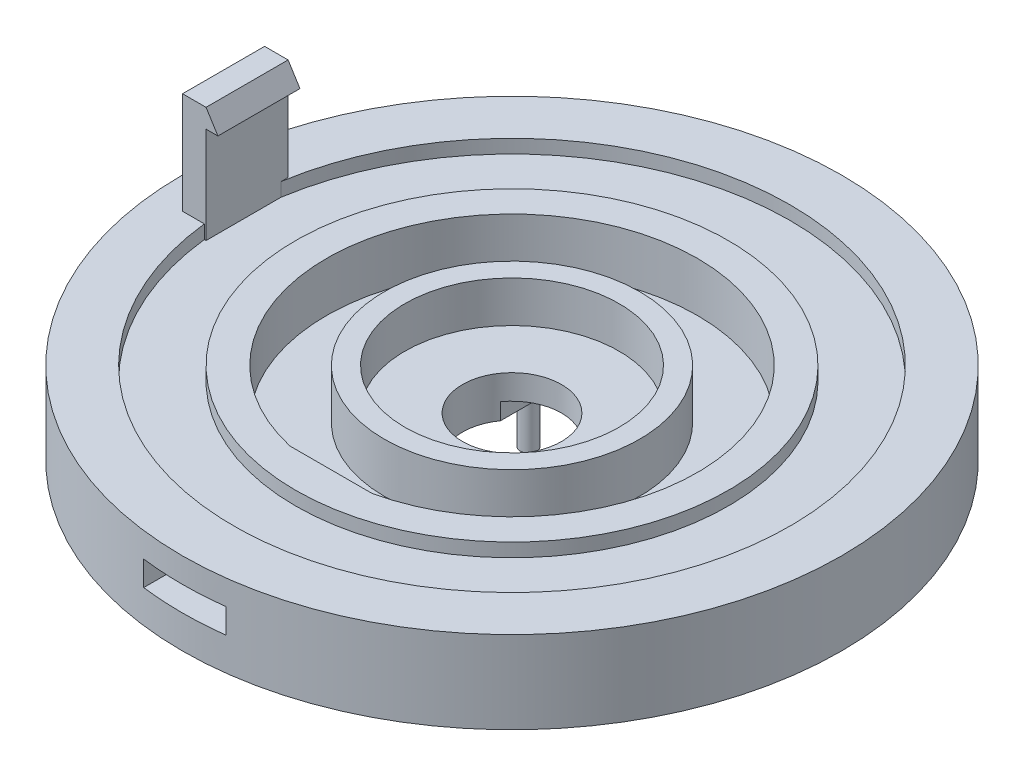
ISO-10303-21;
HEADER;
FILE_DESCRIPTION(('STEP AP214'),'2;1');
FILE_NAME('part.step','',(''),(''),'','','');
FILE_SCHEMA(('AUTOMOTIVE_DESIGN { 1 0 10303 214 1 1 1 1 }'));
ENDSEC;
DATA;
#1=APPLICATION_CONTEXT('core data for automotive mechanical design processes');
#2=APPLICATION_PROTOCOL_DEFINITION('international standard','automotive_design',2000,#1);
#3=PRODUCT_CONTEXT('',#1,'mechanical');
#4=PRODUCT('Part','Part','',(#3));
#5=PRODUCT_RELATED_PRODUCT_CATEGORY('part','',(#4));
#6=PRODUCT_DEFINITION_FORMATION('','',#4);
#7=PRODUCT_DEFINITION_CONTEXT('part definition',#1,'design');
#8=PRODUCT_DEFINITION('design','',#6,#7);
#9=PRODUCT_DEFINITION_SHAPE('','',#8);
#10=(LENGTH_UNIT() NAMED_UNIT(*) SI_UNIT(.MILLI.,.METRE.));
#11=(NAMED_UNIT(*) PLANE_ANGLE_UNIT() SI_UNIT($,.RADIAN.));
#12=(NAMED_UNIT(*) SI_UNIT($,.STERADIAN.) SOLID_ANGLE_UNIT());
#13=UNCERTAINTY_MEASURE_WITH_UNIT(LENGTH_MEASURE(1.E-05),#10,'distance_accuracy_value','');
#14=(GEOMETRIC_REPRESENTATION_CONTEXT(3) GLOBAL_UNCERTAINTY_ASSIGNED_CONTEXT((#13)) GLOBAL_UNIT_ASSIGNED_CONTEXT((#10,
#11,#12)) REPRESENTATION_CONTEXT('',''));
#15=CARTESIAN_POINT('',(0.,0.,0.));
#16=DIRECTION('',(0.,0.,1.));
#17=DIRECTION('',(1.,0.,0.));
#18=AXIS2_PLACEMENT_3D('',#15,#16,#17);
#19=CARTESIAN_POINT('',(0.,10.,0.));
#20=DIRECTION('',(0.,-1.,0.));
#21=DIRECTION('',(0.,0.,-1.));
#22=AXIS2_PLACEMENT_3D('',#19,#20,#21);
#23=PLANE('',#22);
#24=CARTESIAN_POINT('',(1.94458541445556,10.,-4.24128307319286));
#25=DIRECTION('',(0.,1.,0.));
#26=DIRECTION('',(0.,0.,1.));
#27=AXIS2_PLACEMENT_3D('',#24,#25,#26);
#28=CIRCLE('',#27,40.);
#29=CARTESIAN_POINT('',(1.94458541445556,10.,35.7587169268071));
#30=VERTEX_POINT('',#29);
#31=EDGE_CURVE('E253',#30,#30,#28,.T.);
#32=ORIENTED_EDGE('',*,*,#31,.T.);
#33=EDGE_LOOP('',(#32));
#34=FACE_BOUND('',#33,.T.);
#35=DIRECTION('',(1.,0.,0.));
#36=VECTOR('',#35,1.);
#37=CARTESIAN_POINT('',(0.,10.,-0.452703633644858));
#38=LINE('',#37,#36);
#39=CARTESIAN_POINT('',(-34.2364951699685,10.,-0.452703633644858));
#40=VERTEX_POINT('',#39);
#41=CARTESIAN_POINT('',(-31.5920984679773,10.,-0.452703633644858));
#42=VERTEX_POINT('',#41);
#43=EDGE_CURVE('E243',#40,#42,#38,.T.);
#44=ORIENTED_EDGE('',*,*,#43,.F.);
#45=DIRECTION('',(0.,0.,1.));
#46=VECTOR('',#45,1.);
#47=CARTESIAN_POINT('',(-34.2364951699685,10.,0.));
#48=LINE('',#47,#46);
#49=CARTESIAN_POINT('',(-34.2364951699685,10.,-10.4080430251595));
#50=VERTEX_POINT('',#49);
#51=EDGE_CURVE('E12',#50,#40,#48,.T.);
#52=ORIENTED_EDGE('',*,*,#51,.F.);
#53=DIRECTION('',(-1.,0.,0.));
#54=VECTOR('',#53,1.);
#55=CARTESIAN_POINT('',(0.,10.,-10.4080430251595));
#56=LINE('',#55,#54);
#57=CARTESIAN_POINT('',(-31.3854475420589,10.,-10.4080430251595));
#58=VERTEX_POINT('',#57);
#59=EDGE_CURVE('E95',#58,#50,#56,.T.);
#60=ORIENTED_EDGE('',*,*,#59,.F.);
#61=DIRECTION('',(0.,0.,-1.));
#62=VECTOR('',#61,1.);
#63=CARTESIAN_POINT('',(-31.3854475420589,10.,0.));
#64=LINE('',#63,#62);
#65=CARTESIAN_POINT('',(-31.3854475420589,10.,-9.54895705693214));
#66=VERTEX_POINT('',#65);
#67=EDGE_CURVE('E225',#66,#58,#64,.T.);
#68=ORIENTED_EDGE('',*,*,#67,.F.);
#69=CARTESIAN_POINT('',(1.94458541445557,10.,-4.24128307319287));
#70=DIRECTION('',(0.,1.,0.));
#71=DIRECTION('',(0.,0.,1.));
#72=AXIS2_PLACEMENT_3D('',#69,#70,#71);
#73=CIRCLE('',#72,33.75);
#74=EDGE_CURVE('E277',#42,#66,#73,.T.);
#75=ORIENTED_EDGE('',*,*,#74,.F.);
#76=EDGE_LOOP('',(#44,#52,#60,#68,#75));
#77=FACE_BOUND('',#76,.T.);
#78=ADVANCED_FACE('F87',(#34,#77),#23,.F.);
#79=CARTESIAN_POINT('',(1.94458541445557,8.35,-4.24128307319287));
#80=DIRECTION('',(0.,1.,0.));
#81=DIRECTION('',(0.,0.,1.));
#82=AXIS2_PLACEMENT_3D('',#79,#80,#81);
#83=CYLINDRICAL_SURFACE('',#82,33.75);
#84=DIRECTION('',(0.,1.,0.));
#85=VECTOR('',#84,1.);
#86=CARTESIAN_POINT('',(-31.5920984679773,8.35,-0.452703633644858));
#87=LINE('',#86,#85);
#88=CARTESIAN_POINT('',(-31.5920984679773,8.35,-0.452703633644858));
#89=VERTEX_POINT('',#88);
#90=EDGE_CURVE('E241',#42,#89,#87,.F.);
#91=ORIENTED_EDGE('',*,*,#90,.F.);
#92=ORIENTED_EDGE('',*,*,#74,.T.);
#93=DIRECTION('',(0.,1.,0.));
#94=VECTOR('',#93,1.);
#95=CARTESIAN_POINT('',(-31.3854475420589,8.35,-9.54895705693214));
#96=LINE('',#95,#94);
#97=CARTESIAN_POINT('',(-31.3854475420589,8.35,-9.54895705693214));
#98=VERTEX_POINT('',#97);
#99=EDGE_CURVE('E238',#98,#66,#96,.T.);
#100=ORIENTED_EDGE('',*,*,#99,.F.);
#101=CARTESIAN_POINT('',(1.94458541445557,8.35,-4.24128307319287));
#102=DIRECTION('',(0.,1.,0.));
#103=DIRECTION('',(0.,0.,1.));
#104=AXIS2_PLACEMENT_3D('',#101,#102,#103);
#105=CIRCLE('',#104,33.75);
#106=EDGE_CURVE('E280',#89,#98,#105,.T.);
#107=ORIENTED_EDGE('',*,*,#106,.F.);
#108=EDGE_LOOP('',(#91,#92,#100,#107));
#109=FACE_BOUND('',#108,.T.);
#110=ADVANCED_FACE('F391',(#109),#83,.F.);
#111=CARTESIAN_POINT('',(1.94458541445557,8.35,-4.24128307319287));
#112=DIRECTION('',(0.,1.,0.));
#113=DIRECTION('',(0.,0.,1.));
#114=AXIS2_PLACEMENT_3D('',#111,#112,#113);
#115=PLANE('',#114);
#116=CARTESIAN_POINT('',(1.94458541445557,8.35,-4.24128307319287));
#117=DIRECTION('',(0.,1.,0.));
#118=DIRECTION('',(0.,0.,1.));
#119=AXIS2_PLACEMENT_3D('',#116,#117,#118);
#120=CIRCLE('',#119,26.25);
#121=CARTESIAN_POINT('',(1.94458541445557,8.35,22.0087169268071));
#122=VERTEX_POINT('',#121);
#123=EDGE_CURVE('E274',#122,#122,#120,.T.);
#124=ORIENTED_EDGE('',*,*,#123,.F.);
#125=EDGE_LOOP('',(#124));
#126=FACE_BOUND('',#125,.T.);
#127=DIRECTION('',(0.,0.,-1.));
#128=VECTOR('',#127,1.);
#129=CARTESIAN_POINT('',(-31.3854475420589,8.35,-10.4080430251595));
#130=LINE('',#129,#128);
#131=CARTESIAN_POINT('',(-31.3854475420589,8.35,-0.452703633644858));
#132=VERTEX_POINT('',#131);
#133=EDGE_CURVE('E396',#132,#98,#130,.T.);
#134=ORIENTED_EDGE('',*,*,#133,.F.);
#135=DIRECTION('',(-1.,0.,0.));
#136=VECTOR('',#135,1.);
#137=CARTESIAN_POINT('',(1.94458541445557,8.35,-0.452703633644858));
#138=LINE('',#137,#136);
#139=EDGE_CURVE('E373',#132,#89,#138,.T.);
#140=ORIENTED_EDGE('',*,*,#139,.T.);
#141=ORIENTED_EDGE('',*,*,#106,.T.);
#142=EDGE_LOOP('',(#134,#140,#141));
#143=FACE_BOUND('',#142,.T.);
#144=ADVANCED_FACE('F395',(#126,#143),#115,.T.);
#145=CARTESIAN_POINT('',(0.,0.,0.));
#146=DIRECTION('',(0.,-1.,0.));
#147=DIRECTION('',(0.,0.,-1.));
#148=AXIS2_PLACEMENT_3D('',#145,#146,#147);
#149=PLANE('',#148);
#150=DIRECTION('',(0.,0.,-1.));
#151=VECTOR('',#150,1.);
#152=CARTESIAN_POINT('',(-2.93335983094335,0.,-18.6283350162171));
#153=LINE('',#152,#151);
#154=CARTESIAN_POINT('',(-2.93335983094335,0.,-7.73494164020971));
#155=VERTEX_POINT('',#154);
#156=CARTESIAN_POINT('',(-2.93335983094335,0.,-18.6283350162171));
#157=VERTEX_POINT('',#156);
#158=EDGE_CURVE('E259',#155,#157,#153,.T.);
#159=ORIENTED_EDGE('',*,*,#158,.F.);
#160=CARTESIAN_POINT('',(1.94458541445556,0.,-4.24128307319286));
#161=DIRECTION('',(0.,1.,0.));
#162=DIRECTION('',(0.,0.,1.));
#163=AXIS2_PLACEMENT_3D('',#160,#161,#162);
#164=CIRCLE('',#163,6.);
#165=CARTESIAN_POINT('',(6.86664016905719,0.,-7.67251856390221));
#166=VERTEX_POINT('',#165);
#167=EDGE_CURVE('E356',#155,#166,#164,.T.);
#168=ORIENTED_EDGE('',*,*,#167,.T.);
#169=DIRECTION('',(0.,0.,1.));
#170=VECTOR('',#169,1.);
#171=CARTESIAN_POINT('',(6.86664016905719,0.,-7.59099295485299));
#172=LINE('',#171,#170);
#173=CARTESIAN_POINT('',(6.86664016905719,0.,-18.6283350162171));
#174=VERTEX_POINT('',#173);
#175=EDGE_CURVE('E266',#174,#166,#172,.T.);
#176=ORIENTED_EDGE('',*,*,#175,.F.);
#177=DIRECTION('',(1.,0.,0.));
#178=VECTOR('',#177,1.);
#179=CARTESIAN_POINT('',(6.86664016905719,0.,-18.6283350162171));
#180=LINE('',#179,#178);
#181=EDGE_CURVE('E256',#157,#174,#180,.T.);
#182=ORIENTED_EDGE('',*,*,#181,.F.);
#183=EDGE_LOOP('',(#159,#168,#176,#182));
#184=FACE_BOUND('',#183,.T.);
#185=CARTESIAN_POINT('',(-8.55541458554444,0.,-4.24128307319286));
#186=DIRECTION('',(0.,-1.,0.));
#187=DIRECTION('',(0.,0.,1.));
#188=AXIS2_PLACEMENT_3D('',#185,#186,#187);
#189=CIRCLE('',#188,1.);
#190=CARTESIAN_POINT('',(-8.55541458554444,0.,-3.24128307319286));
#191=VERTEX_POINT('',#190);
#192=EDGE_CURVE('E321',#191,#191,#189,.T.);
#193=ORIENTED_EDGE('',*,*,#192,.F.);
#194=EDGE_LOOP('',(#193));
#195=FACE_BOUND('',#194,.T.);
#196=CARTESIAN_POINT('',(-8.55541458554444,0.,-16.7412830731929));
#197=DIRECTION('',(0.,-1.,0.));
#198=DIRECTION('',(0.,0.,1.));
#199=AXIS2_PLACEMENT_3D('',#196,#197,#198);
#200=CIRCLE('',#199,1.);
#201=CARTESIAN_POINT('',(-8.55541458554444,0.,-15.7412830731929));
#202=VERTEX_POINT('',#201);
#203=EDGE_CURVE('E327',#202,#202,#200,.T.);
#204=ORIENTED_EDGE('',*,*,#203,.F.);
#205=EDGE_LOOP('',(#204));
#206=FACE_BOUND('',#205,.T.);
#207=CARTESIAN_POINT('',(12.4445854144556,0.,-4.24128307319286));
#208=DIRECTION('',(0.,-1.,0.));
#209=DIRECTION('',(0.,0.,-1.));
#210=AXIS2_PLACEMENT_3D('',#207,#208,#209);
#211=CIRCLE('',#210,1.);
#212=CARTESIAN_POINT('',(12.4445854144556,0.,-5.24128307319286));
#213=VERTEX_POINT('',#212);
#214=EDGE_CURVE('E333',#213,#213,#211,.T.);
#215=ORIENTED_EDGE('',*,*,#214,.F.);
#216=EDGE_LOOP('',(#215));
#217=FACE_BOUND('',#216,.T.);
#218=CARTESIAN_POINT('',(12.4445854144556,0.,-16.7412830731929));
#219=DIRECTION('',(0.,-1.,0.));
#220=DIRECTION('',(0.,0.,-1.));
#221=AXIS2_PLACEMENT_3D('',#218,#219,#220);
#222=CIRCLE('',#221,1.);
#223=CARTESIAN_POINT('',(12.4445854144556,0.,-17.7412830731929));
#224=VERTEX_POINT('',#223);
#225=EDGE_CURVE('E339',#224,#224,#222,.T.);
#226=ORIENTED_EDGE('',*,*,#225,.F.);
#227=EDGE_LOOP('',(#226));
#228=FACE_BOUND('',#227,.T.);
#229=CARTESIAN_POINT('',(1.94458541445556,0.,-4.24128307319286));
#230=DIRECTION('',(0.,-1.,0.));
#231=DIRECTION('',(0.,0.,-1.));
#232=AXIS2_PLACEMENT_3D('',#229,#230,#231);
#233=CIRCLE('',#232,40.);
#234=CARTESIAN_POINT('',(1.94458541445556,0.,-44.2412830731929));
#235=VERTEX_POINT('',#234);
#236=EDGE_CURVE('E368',#235,#235,#233,.T.);
#237=ORIENTED_EDGE('',*,*,#236,.T.);
#238=EDGE_LOOP('',(#237));
#239=FACE_BOUND('',#238,.T.);
#240=ADVANCED_FACE('F89',(#184,#195,#206,#217,#228,#239),#149,.T.);
#241=CARTESIAN_POINT('',(1.94458541445556,4.,-4.24128307319286));
#242=DIRECTION('',(0.,1.,0.));
#243=DIRECTION('',(0.,0.,1.));
#244=AXIS2_PLACEMENT_3D('',#241,#242,#243);
#245=PLANE('',#244);
#246=CARTESIAN_POINT('',(1.94458541445556,4.,-4.24128307319286));
#247=DIRECTION('',(0.,1.,0.));
#248=DIRECTION('',(0.,0.,1.));
#249=AXIS2_PLACEMENT_3D('',#246,#247,#248);
#250=CIRCLE('',#249,15.5);
#251=CARTESIAN_POINT('',(1.94458541445556,4.,11.2587169268071));
#252=VERTEX_POINT('',#251);
#253=EDGE_CURVE('E312',#252,#252,#250,.T.);
#254=ORIENTED_EDGE('',*,*,#253,.F.);
#255=EDGE_LOOP('',(#254));
#256=FACE_BOUND('',#255,.T.);
#257=CARTESIAN_POINT('',(1.94458541445556,4.,-4.24128307319286));
#258=DIRECTION('',(0.,1.,0.));
#259=DIRECTION('',(0.,0.,1.));
#260=AXIS2_PLACEMENT_3D('',#257,#258,#259);
#261=CIRCLE('',#260,40.);
#262=CARTESIAN_POINT('',(-3.05541458554445,4.,35.444986592776));
#263=VERTEX_POINT('',#262);
#264=CARTESIAN_POINT('',(6.94458541445556,4.,35.444986592776));
#265=VERTEX_POINT('',#264);
#266=EDGE_CURVE('E251',#263,#265,#261,.T.);
#267=ORIENTED_EDGE('',*,*,#266,.T.);
#268=DIRECTION('',(0.,0.,1.));
#269=VECTOR('',#268,1.);
#270=CARTESIAN_POINT('',(6.94458541445559,4.,0.));
#271=LINE('',#270,#269);
#272=CARTESIAN_POINT('',(6.94458541445557,4.,17.6961278952874));
#273=VERTEX_POINT('',#272);
#274=EDGE_CURVE('E300',#273,#265,#271,.T.);
#275=ORIENTED_EDGE('',*,*,#274,.F.);
#276=CARTESIAN_POINT('',(1.94458541445556,4.,-4.24128307319286));
#277=DIRECTION('',(0.,1.,0.));
#278=DIRECTION('',(0.,0.,1.));
#279=AXIS2_PLACEMENT_3D('',#276,#277,#278);
#280=CIRCLE('',#279,22.5);
#281=CARTESIAN_POINT('',(-3.05541458554445,4.,17.6961278952874));
#282=VERTEX_POINT('',#281);
#283=EDGE_CURVE('E318',#273,#282,#280,.T.);
#284=ORIENTED_EDGE('',*,*,#283,.T.);
#285=DIRECTION('',(0.,0.,-1.));
#286=VECTOR('',#285,1.);
#287=CARTESIAN_POINT('',(-3.05541458554445,4.,0.));
#288=LINE('',#287,#286);
#289=EDGE_CURVE('E303',#263,#282,#288,.T.);
#290=ORIENTED_EDGE('',*,*,#289,.F.);
#291=EDGE_LOOP('',(#267,#275,#284,#290));
#292=FACE_BOUND('',#291,.T.);
#293=ADVANCED_FACE('F474',(#256,#292),#245,.T.);
#294=CARTESIAN_POINT('',(9.94458541445556,7.,35.7587169268071));
#295=DIRECTION('',(0.,1.,0.));
#296=DIRECTION('',(0.,0.,1.));
#297=AXIS2_PLACEMENT_3D('',#294,#295,#296);
#298=PLANE('',#297);
#299=DIRECTION('',(0.,0.,-1.));
#300=VECTOR('',#299,1.);
#301=CARTESIAN_POINT('',(6.94458541445559,7.,0.));
#302=LINE('',#301,#300);
#303=CARTESIAN_POINT('',(6.94458541445556,7.,35.444986592776));
#304=VERTEX_POINT('',#303);
#305=CARTESIAN_POINT('',(6.94458541445557,7.,17.6961278952874));
#306=VERTEX_POINT('',#305);
#307=EDGE_CURVE('E298',#304,#306,#302,.T.);
#308=ORIENTED_EDGE('',*,*,#307,.F.);
#309=CARTESIAN_POINT('',(1.94458541445556,7.,-4.24128307319286));
#310=DIRECTION('',(0.,1.,0.));
#311=DIRECTION('',(0.,0.,1.));
#312=AXIS2_PLACEMENT_3D('',#309,#310,#311);
#313=CIRCLE('',#312,40.);
#314=CARTESIAN_POINT('',(-3.05541458554444,7.,35.444986592776));
#315=VERTEX_POINT('',#314);
#316=EDGE_CURVE('E371',#315,#304,#313,.T.);
#317=ORIENTED_EDGE('',*,*,#316,.F.);
#318=DIRECTION('',(0.,0.,-1.));
#319=VECTOR('',#318,1.);
#320=CARTESIAN_POINT('',(-3.05541458554445,7.,35.7587169268071));
#321=LINE('',#320,#319);
#322=CARTESIAN_POINT('',(-3.05541458554445,7.,17.6961278952874));
#323=VERTEX_POINT('',#322);
#324=EDGE_CURVE('E283',#315,#323,#321,.T.);
#325=ORIENTED_EDGE('',*,*,#324,.T.);
#326=DIRECTION('',(-1.,0.,0.));
#327=VECTOR('',#326,1.);
#328=CARTESIAN_POINT('',(9.94458541445556,7.,17.6961278952874));
#329=LINE('',#328,#327);
#330=EDGE_CURVE('E292',#306,#323,#329,.T.);
#331=ORIENTED_EDGE('',*,*,#330,.F.);
#332=EDGE_LOOP('',(#308,#317,#325,#331));
#333=FACE_BOUND('',#332,.T.);
#334=ADVANCED_FACE('F476',(#333),#298,.F.);
#335=CARTESIAN_POINT('',(6.94458541445559,4.,0.));
#336=DIRECTION('',(-1.,0.,0.));
#337=DIRECTION('',(0.,0.,1.));
#338=AXIS2_PLACEMENT_3D('',#335,#336,#337);
#339=PLANE('',#338);
#340=ORIENTED_EDGE('',*,*,#274,.T.);
#341=DIRECTION('',(0.,1.,0.));
#342=VECTOR('',#341,1.);
#343=CARTESIAN_POINT('',(6.94458541445556,-10.,35.444986592776));
#344=LINE('',#343,#342);
#345=EDGE_CURVE('E245',#265,#304,#344,.T.);
#346=ORIENTED_EDGE('',*,*,#345,.T.);
#347=ORIENTED_EDGE('',*,*,#307,.T.);
#348=DIRECTION('',(0.,1.,0.));
#349=VECTOR('',#348,1.);
#350=CARTESIAN_POINT('',(6.94458541445557,4.,17.6961278952874));
#351=LINE('',#350,#349);
#352=EDGE_CURVE('E305',#273,#306,#351,.T.);
#353=ORIENTED_EDGE('',*,*,#352,.F.);
#354=EDGE_LOOP('',(#340,#346,#347,#353));
#355=FACE_BOUND('',#354,.T.);
#356=ADVANCED_FACE('F472',(#355),#339,.T.);
#357=CARTESIAN_POINT('',(-3.05541458554445,4.,0.));
#358=DIRECTION('',(1.,0.,0.));
#359=DIRECTION('',(0.,0.,-1.));
#360=AXIS2_PLACEMENT_3D('',#357,#358,#359);
#361=PLANE('',#360);
#362=ORIENTED_EDGE('',*,*,#324,.F.);
#363=DIRECTION('',(0.,1.,0.));
#364=VECTOR('',#363,1.);
#365=CARTESIAN_POINT('',(-3.05541458554445,-10.,35.444986592776));
#366=LINE('',#365,#364);
#367=EDGE_CURVE('E248',#315,#263,#366,.F.);
#368=ORIENTED_EDGE('',*,*,#367,.T.);
#369=ORIENTED_EDGE('',*,*,#289,.T.);
#370=DIRECTION('',(0.,1.,0.));
#371=VECTOR('',#370,1.);
#372=CARTESIAN_POINT('',(-3.05541458554445,4.,17.6961278952874));
#373=LINE('',#372,#371);
#374=EDGE_CURVE('E306',#282,#323,#373,.T.);
#375=ORIENTED_EDGE('',*,*,#374,.T.);
#376=EDGE_LOOP('',(#362,#368,#369,#375));
#377=FACE_BOUND('',#376,.T.);
#378=ADVANCED_FACE('F436',(#377),#361,.T.);
#379=CARTESIAN_POINT('',(1.94458541445556,10.,-4.24128307319286));
#380=DIRECTION('',(0.,1.,0.));
#381=DIRECTION('',(0.,0.,1.));
#382=AXIS2_PLACEMENT_3D('',#379,#380,#381);
#383=CIRCLE('',#382,22.5);
#384=CARTESIAN_POINT('',(6.94458541445556,10.,17.6961278952874));
#385=VERTEX_POINT('',#384);
#386=CARTESIAN_POINT('',(-3.05541458554445,10.,17.6961278952874));
#387=VERTEX_POINT('',#386);
#388=EDGE_CURVE('E315',#385,#387,#383,.T.);
#389=ORIENTED_EDGE('',*,*,#388,.F.);
#390=DIRECTION('',(-1.,0.,0.));
#391=VECTOR('',#390,1.);
#392=CARTESIAN_POINT('',(9.94458541445556,10.,17.6961278952874));
#393=LINE('',#392,#391);
#394=EDGE_CURVE('E289',#385,#387,#393,.T.);
#395=ORIENTED_EDGE('',*,*,#394,.T.);
#396=EDGE_LOOP('',(#389,#395));
#397=FACE_BOUND('',#396,.T.);
#398=CARTESIAN_POINT('',(1.94458541445557,10.,-4.24128307319287));
#399=DIRECTION('',(0.,1.,0.));
#400=DIRECTION('',(0.,0.,1.));
#401=AXIS2_PLACEMENT_3D('',#398,#399,#400);
#402=CIRCLE('',#401,26.25);
#403=CARTESIAN_POINT('',(1.94458541445557,10.,22.0087169268071));
#404=VERTEX_POINT('',#403);
#405=EDGE_CURVE('E272',#404,#404,#402,.T.);
#406=ORIENTED_EDGE('',*,*,#405,.T.);
#407=EDGE_LOOP('',(#406));
#408=FACE_BOUND('',#407,.T.);
#409=ADVANCED_FACE('F426',(#397,#408),#23,.F.);
#410=CARTESIAN_POINT('',(1.94458541445556,4.,-4.24128307319286));
#411=DIRECTION('',(0.,1.,0.));
#412=DIRECTION('',(0.,0.,1.));
#413=AXIS2_PLACEMENT_3D('',#410,#411,#412);
#414=CYLINDRICAL_SURFACE('',#413,22.5);
#415=ORIENTED_EDGE('',*,*,#352,.T.);
#416=DIRECTION('',(0.,1.,0.));
#417=VECTOR('',#416,1.);
#418=CARTESIAN_POINT('',(6.94458541445557,4.,17.6961278952874));
#419=LINE('',#418,#417);
#420=EDGE_CURVE('E295',#306,#385,#419,.T.);
#421=ORIENTED_EDGE('',*,*,#420,.T.);
#422=ORIENTED_EDGE('',*,*,#388,.T.);
#423=DIRECTION('',(0.,1.,0.));
#424=VECTOR('',#423,1.);
#425=CARTESIAN_POINT('',(-3.05541458554445,7.,17.6961278952874));
#426=LINE('',#425,#424);
#427=EDGE_CURVE('E287',#323,#387,#426,.T.);
#428=ORIENTED_EDGE('',*,*,#427,.F.);
#429=ORIENTED_EDGE('',*,*,#374,.F.);
#430=ORIENTED_EDGE('',*,*,#283,.F.);
#431=EDGE_LOOP('',(#415,#421,#422,#428,#429,#430));
#432=FACE_BOUND('',#431,.T.);
#433=ADVANCED_FACE('F435',(#432),#414,.F.);
#434=CARTESIAN_POINT('',(1.94458541445556,10.,-4.24128307319286));
#435=DIRECTION('',(0.,1.,0.));
#436=DIRECTION('',(0.,0.,1.));
#437=AXIS2_PLACEMENT_3D('',#434,#435,#436);
#438=CIRCLE('',#437,13.);
#439=CARTESIAN_POINT('',(1.94458541445556,10.,8.75871692680714));
#440=VERTEX_POINT('',#439);
#441=EDGE_CURVE('E345',#440,#440,#438,.T.);
#442=ORIENTED_EDGE('',*,*,#441,.F.);
#443=EDGE_LOOP('',(#442));
#444=FACE_BOUND('',#443,.T.);
#445=CARTESIAN_POINT('',(1.94458541445556,10.,-4.24128307319286));
#446=DIRECTION('',(0.,1.,0.));
#447=DIRECTION('',(0.,0.,1.));
#448=AXIS2_PLACEMENT_3D('',#445,#446,#447);
#449=CIRCLE('',#448,15.5);
#450=CARTESIAN_POINT('',(1.94458541445556,10.,11.2587169268071));
#451=VERTEX_POINT('',#450);
#452=EDGE_CURVE('E309',#451,#451,#449,.T.);
#453=ORIENTED_EDGE('',*,*,#452,.T.);
#454=EDGE_LOOP('',(#453));
#455=FACE_BOUND('',#454,.T.);
#456=ADVANCED_FACE('F427',(#444,#455),#23,.F.);
#457=CARTESIAN_POINT('',(1.94458541445556,10.,-4.24128307319286));
#458=DIRECTION('',(0.,1.,0.));
#459=DIRECTION('',(0.,0.,1.));
#460=AXIS2_PLACEMENT_3D('',#457,#458,#459);
#461=CYLINDRICAL_SURFACE('',#460,6.);
#462=ORIENTED_EDGE('',*,*,#167,.F.);
#463=DIRECTION('',(0.,1.,0.));
#464=VECTOR('',#463,1.);
#465=CARTESIAN_POINT('',(-2.93335983094335,10.,-7.73494164020971));
#466=LINE('',#465,#464);
#467=CARTESIAN_POINT('',(-2.93335983094335,2.,-7.73494164020971));
#468=VERTEX_POINT('',#467);
#469=EDGE_CURVE('E365',#155,#468,#466,.T.);
#470=ORIENTED_EDGE('',*,*,#469,.T.);
#471=CARTESIAN_POINT('',(1.94458541445556,2.,-4.24128307319286));
#472=DIRECTION('',(0.,1.,0.));
#473=DIRECTION('',(0.,0.,1.));
#474=AXIS2_PLACEMENT_3D('',#471,#472,#473);
#475=CIRCLE('',#474,6.);
#476=CARTESIAN_POINT('',(6.86664016905719,2.,-7.67251856390221));
#477=VERTEX_POINT('',#476);
#478=EDGE_CURVE('E359',#468,#477,#475,.F.);
#479=ORIENTED_EDGE('',*,*,#478,.T.);
#480=DIRECTION('',(0.,1.,0.));
#481=VECTOR('',#480,1.);
#482=CARTESIAN_POINT('',(6.86664016905719,10.,-7.67251856390221));
#483=LINE('',#482,#481);
#484=EDGE_CURVE('E362',#477,#166,#483,.F.);
#485=ORIENTED_EDGE('',*,*,#484,.T.);
#486=EDGE_LOOP('',(#462,#470,#479,#485));
#487=FACE_BOUND('',#486,.T.);
#488=CARTESIAN_POINT('',(1.94458541445556,5.,-4.24128307319286));
#489=DIRECTION('',(0.,1.,0.));
#490=DIRECTION('',(0.,0.,1.));
#491=AXIS2_PLACEMENT_3D('',#488,#489,#490);
#492=CIRCLE('',#491,6.);
#493=CARTESIAN_POINT('',(1.94458541445556,5.,1.75871692680714));
#494=VERTEX_POINT('',#493);
#495=EDGE_CURVE('E353',#494,#494,#492,.T.);
#496=ORIENTED_EDGE('',*,*,#495,.T.);
#497=EDGE_LOOP('',(#496));
#498=FACE_BOUND('',#497,.T.);
#499=ADVANCED_FACE('F439',(#487,#498),#461,.F.);
#500=CARTESIAN_POINT('',(7.94458541445556,5.,-4.24128307319286));
#501=DIRECTION('',(0.,-1.,0.));
#502=DIRECTION('',(0.,0.,-1.));
#503=AXIS2_PLACEMENT_3D('',#500,#501,#502);
#504=PLANE('',#503);
#505=ORIENTED_EDGE('',*,*,#495,.F.);
#506=EDGE_LOOP('',(#505));
#507=FACE_BOUND('',#506,.T.);
#508=CARTESIAN_POINT('',(1.94458541445556,5.,-4.24128307319286));
#509=DIRECTION('',(0.,1.,0.));
#510=DIRECTION('',(0.,0.,1.));
#511=AXIS2_PLACEMENT_3D('',#508,#509,#510);
#512=CIRCLE('',#511,13.);
#513=CARTESIAN_POINT('',(1.94458541445556,5.,8.75871692680714));
#514=VERTEX_POINT('',#513);
#515=EDGE_CURVE('E350',#514,#514,#512,.T.);
#516=ORIENTED_EDGE('',*,*,#515,.T.);
#517=EDGE_LOOP('',(#516));
#518=FACE_BOUND('',#517,.T.);
#519=ADVANCED_FACE('F446',(#507,#518),#504,.F.);
#520=CARTESIAN_POINT('',(1.94458541445556,10.,-4.24128307319286));
#521=DIRECTION('',(0.,1.,0.));
#522=DIRECTION('',(0.,0.,1.));
#523=AXIS2_PLACEMENT_3D('',#520,#521,#522);
#524=CYLINDRICAL_SURFACE('',#523,13.);
#525=ORIENTED_EDGE('',*,*,#515,.F.);
#526=EDGE_LOOP('',(#525));
#527=FACE_BOUND('',#526,.T.);
#528=ORIENTED_EDGE('',*,*,#441,.T.);
#529=EDGE_LOOP('',(#528));
#530=FACE_BOUND('',#529,.T.);
#531=ADVANCED_FACE('F505',(#527,#530),#524,.F.);
#532=CARTESIAN_POINT('',(12.4445854144556,-10.,-16.7412830731929));
#533=DIRECTION('',(0.,1.,0.));
#534=DIRECTION('',(0.,0.,1.));
#535=AXIS2_PLACEMENT_3D('',#532,#533,#534);
#536=CYLINDRICAL_SURFACE('',#535,1.);
#537=CARTESIAN_POINT('',(12.4445854144556,-10.,-16.7412830731929));
#538=DIRECTION('',(0.,-1.,0.));
#539=DIRECTION('',(0.,0.,-1.));
#540=AXIS2_PLACEMENT_3D('',#537,#538,#539);
#541=CIRCLE('',#540,1.);
#542=CARTESIAN_POINT('',(12.4445854144556,-10.,-17.7412830731929));
#543=VERTEX_POINT('',#542);
#544=EDGE_CURVE('E342',#543,#543,#541,.T.);
#545=ORIENTED_EDGE('',*,*,#544,.F.);
#546=EDGE_LOOP('',(#545));
#547=FACE_BOUND('',#546,.T.);
#548=ORIENTED_EDGE('',*,*,#225,.T.);
#549=EDGE_LOOP('',(#548));
#550=FACE_BOUND('',#549,.T.);
#551=ADVANCED_FACE('F501',(#547,#550),#536,.T.);
#552=CARTESIAN_POINT('',(12.4445854144556,-10.,-16.7412830731929));
#553=DIRECTION('',(0.,-1.,0.));
#554=DIRECTION('',(0.,0.,-1.));
#555=AXIS2_PLACEMENT_3D('',#552,#553,#554);
#556=PLANE('',#555);
#557=ORIENTED_EDGE('',*,*,#544,.T.);
#558=EDGE_LOOP('',(#557));
#559=FACE_BOUND('',#558,.T.);
#560=ADVANCED_FACE('F497',(#559),#556,.T.);
#561=CARTESIAN_POINT('',(12.4445854144556,-10.,-4.24128307319286));
#562=DIRECTION('',(0.,1.,0.));
#563=DIRECTION('',(0.,0.,1.));
#564=AXIS2_PLACEMENT_3D('',#561,#562,#563);
#565=CYLINDRICAL_SURFACE('',#564,1.);
#566=CARTESIAN_POINT('',(12.4445854144556,-10.,-4.24128307319286));
#567=DIRECTION('',(0.,-1.,0.));
#568=DIRECTION('',(0.,0.,-1.));
#569=AXIS2_PLACEMENT_3D('',#566,#567,#568);
#570=CIRCLE('',#569,1.);
#571=CARTESIAN_POINT('',(12.4445854144556,-10.,-5.24128307319286));
#572=VERTEX_POINT('',#571);
#573=EDGE_CURVE('E336',#572,#572,#570,.T.);
#574=ORIENTED_EDGE('',*,*,#573,.F.);
#575=EDGE_LOOP('',(#574));
#576=FACE_BOUND('',#575,.T.);
#577=ORIENTED_EDGE('',*,*,#214,.T.);
#578=EDGE_LOOP('',(#577));
#579=FACE_BOUND('',#578,.T.);
#580=ADVANCED_FACE('F493',(#576,#579),#565,.T.);
#581=CARTESIAN_POINT('',(12.4445854144556,-10.,-4.24128307319286));
#582=DIRECTION('',(0.,-1.,0.));
#583=DIRECTION('',(0.,0.,-1.));
#584=AXIS2_PLACEMENT_3D('',#581,#582,#583);
#585=PLANE('',#584);
#586=ORIENTED_EDGE('',*,*,#573,.T.);
#587=EDGE_LOOP('',(#586));
#588=FACE_BOUND('',#587,.T.);
#589=ADVANCED_FACE('F489',(#588),#585,.T.);
#590=CARTESIAN_POINT('',(-8.55541458554444,-10.,-16.7412830731929));
#591=DIRECTION('',(0.,1.,0.));
#592=DIRECTION('',(0.,0.,1.));
#593=AXIS2_PLACEMENT_3D('',#590,#591,#592);
#594=CYLINDRICAL_SURFACE('',#593,1.);
#595=CARTESIAN_POINT('',(-8.55541458554444,-10.,-16.7412830731929));
#596=DIRECTION('',(0.,-1.,0.));
#597=DIRECTION('',(0.,0.,1.));
#598=AXIS2_PLACEMENT_3D('',#595,#596,#597);
#599=CIRCLE('',#598,1.);
#600=CARTESIAN_POINT('',(-8.55541458554444,-10.,-15.7412830731929));
#601=VERTEX_POINT('',#600);
#602=EDGE_CURVE('E330',#601,#601,#599,.T.);
#603=ORIENTED_EDGE('',*,*,#602,.F.);
#604=EDGE_LOOP('',(#603));
#605=FACE_BOUND('',#604,.T.);
#606=ORIENTED_EDGE('',*,*,#203,.T.);
#607=EDGE_LOOP('',(#606));
#608=FACE_BOUND('',#607,.T.);
#609=ADVANCED_FACE('F485',(#605,#608),#594,.T.);
#610=CARTESIAN_POINT('',(-8.55541458554444,-10.,-16.7412830731929));
#611=DIRECTION('',(0.,1.,0.));
#612=DIRECTION('',(0.,0.,1.));
#613=AXIS2_PLACEMENT_3D('',#610,#611,#612);
#614=PLANE('',#613);
#615=ORIENTED_EDGE('',*,*,#602,.T.);
#616=EDGE_LOOP('',(#615));
#617=FACE_BOUND('',#616,.T.);
#618=ADVANCED_FACE('F481',(#617),#614,.F.);
#619=CARTESIAN_POINT('',(-8.55541458554444,-10.,-4.24128307319286));
#620=DIRECTION('',(0.,1.,0.));
#621=DIRECTION('',(0.,0.,1.));
#622=AXIS2_PLACEMENT_3D('',#619,#620,#621);
#623=CYLINDRICAL_SURFACE('',#622,1.);
#624=CARTESIAN_POINT('',(-8.55541458554444,-10.,-4.24128307319286));
#625=DIRECTION('',(0.,-1.,0.));
#626=DIRECTION('',(0.,0.,1.));
#627=AXIS2_PLACEMENT_3D('',#624,#625,#626);
#628=CIRCLE('',#627,1.);
#629=CARTESIAN_POINT('',(-8.55541458554444,-10.,-3.24128307319286));
#630=VERTEX_POINT('',#629);
#631=EDGE_CURVE('E324',#630,#630,#628,.T.);
#632=ORIENTED_EDGE('',*,*,#631,.F.);
#633=EDGE_LOOP('',(#632));
#634=FACE_BOUND('',#633,.T.);
#635=ORIENTED_EDGE('',*,*,#192,.T.);
#636=EDGE_LOOP('',(#635));
#637=FACE_BOUND('',#636,.T.);
#638=ADVANCED_FACE('F467',(#634,#637),#623,.T.);
#639=CARTESIAN_POINT('',(-8.55541458554444,-10.,-4.24128307319286));
#640=DIRECTION('',(0.,1.,0.));
#641=DIRECTION('',(0.,0.,1.));
#642=AXIS2_PLACEMENT_3D('',#639,#640,#641);
#643=PLANE('',#642);
#644=ORIENTED_EDGE('',*,*,#631,.T.);
#645=EDGE_LOOP('',(#644));
#646=FACE_BOUND('',#645,.T.);
#647=ADVANCED_FACE('F457',(#646),#643,.F.);
#648=CARTESIAN_POINT('',(1.94458541445556,4.,-4.24128307319286));
#649=DIRECTION('',(0.,1.,0.));
#650=DIRECTION('',(0.,0.,1.));
#651=AXIS2_PLACEMENT_3D('',#648,#649,#650);
#652=CYLINDRICAL_SURFACE('',#651,15.5);
#653=ORIENTED_EDGE('',*,*,#253,.T.);
#654=EDGE_LOOP('',(#653));
#655=FACE_BOUND('',#654,.T.);
#656=ORIENTED_EDGE('',*,*,#452,.F.);
#657=EDGE_LOOP('',(#656));
#658=FACE_BOUND('',#657,.T.);
#659=ADVANCED_FACE('F454',(#655,#658),#652,.T.);
#660=CARTESIAN_POINT('',(9.94458541445556,7.,17.6961278952874));
#661=DIRECTION('',(0.,0.,1.));
#662=DIRECTION('',(1.,0.,0.));
#663=AXIS2_PLACEMENT_3D('',#660,#661,#662);
#664=PLANE('',#663);
#665=ORIENTED_EDGE('',*,*,#420,.F.);
#666=ORIENTED_EDGE('',*,*,#330,.T.);
#667=ORIENTED_EDGE('',*,*,#427,.T.);
#668=ORIENTED_EDGE('',*,*,#394,.F.);
#669=EDGE_LOOP('',(#665,#666,#667,#668));
#670=FACE_BOUND('',#669,.T.);
#671=ADVANCED_FACE('F456',(#670),#664,.F.);
#672=CARTESIAN_POINT('',(1.94458541445557,8.35,-4.24128307319287));
#673=DIRECTION('',(0.,1.,0.));
#674=DIRECTION('',(0.,0.,1.));
#675=AXIS2_PLACEMENT_3D('',#672,#673,#674);
#676=CYLINDRICAL_SURFACE('',#675,26.25);
#677=ORIENTED_EDGE('',*,*,#123,.T.);
#678=EDGE_LOOP('',(#677));
#679=FACE_BOUND('',#678,.T.);
#680=ORIENTED_EDGE('',*,*,#405,.F.);
#681=EDGE_LOOP('',(#680));
#682=FACE_BOUND('',#681,.T.);
#683=ADVANCED_FACE('F464',(#679,#682),#676,.T.);
#684=CARTESIAN_POINT('',(-2.93335983094335,2.,-18.6283350162171));
#685=DIRECTION('',(-1.,0.,0.));
#686=DIRECTION('',(0.,0.,1.));
#687=AXIS2_PLACEMENT_3D('',#684,#685,#686);
#688=PLANE('',#687);
#689=ORIENTED_EDGE('',*,*,#158,.T.);
#690=DIRECTION('',(0.,-1.,0.));
#691=VECTOR('',#690,1.);
#692=CARTESIAN_POINT('',(-2.93335983094335,2.,-18.6283350162171));
#693=LINE('',#692,#691);
#694=CARTESIAN_POINT('',(-2.93335983094335,2.,-18.6283350162171));
#695=VERTEX_POINT('',#694);
#696=EDGE_CURVE('E269',#695,#157,#693,.T.);
#697=ORIENTED_EDGE('',*,*,#696,.F.);
#698=DIRECTION('',(0.,0.,-1.));
#699=VECTOR('',#698,1.);
#700=CARTESIAN_POINT('',(-2.93335983094335,2.,-18.6283350162171));
#701=LINE('',#700,#699);
#702=EDGE_CURVE('E261',#468,#695,#701,.T.);
#703=ORIENTED_EDGE('',*,*,#702,.F.);
#704=ORIENTED_EDGE('',*,*,#469,.F.);
#705=EDGE_LOOP('',(#689,#697,#703,#704));
#706=FACE_BOUND('',#705,.T.);
#707=ADVANCED_FACE('F591',(#706),#688,.F.);
#708=CARTESIAN_POINT('',(6.86664016905719,2.,-7.59099295485299));
#709=DIRECTION('',(1.,0.,0.));
#710=DIRECTION('',(0.,0.,-1.));
#711=AXIS2_PLACEMENT_3D('',#708,#709,#710);
#712=PLANE('',#711);
#713=DIRECTION('',(0.,0.,1.));
#714=VECTOR('',#713,1.);
#715=CARTESIAN_POINT('',(6.86664016905719,2.,-7.59099295485299));
#716=LINE('',#715,#714);
#717=CARTESIAN_POINT('',(6.86664016905719,2.,-18.6283350162171));
#718=VERTEX_POINT('',#717);
#719=EDGE_CURVE('E110',#718,#477,#716,.T.);
#720=ORIENTED_EDGE('',*,*,#719,.F.);
#721=DIRECTION('',(0.,-1.,0.));
#722=VECTOR('',#721,1.);
#723=CARTESIAN_POINT('',(6.86664016905719,2.,-18.6283350162171));
#724=LINE('',#723,#722);
#725=EDGE_CURVE('E263',#718,#174,#724,.T.);
#726=ORIENTED_EDGE('',*,*,#725,.T.);
#727=ORIENTED_EDGE('',*,*,#175,.T.);
#728=ORIENTED_EDGE('',*,*,#484,.F.);
#729=EDGE_LOOP('',(#720,#726,#727,#728));
#730=FACE_BOUND('',#729,.T.);
#731=ADVANCED_FACE('F604',(#730),#712,.F.);
#732=CARTESIAN_POINT('',(0.,2.,0.));
#733=DIRECTION('',(0.,1.,0.));
#734=DIRECTION('',(0.,0.,1.));
#735=AXIS2_PLACEMENT_3D('',#732,#733,#734);
#736=PLANE('',#735);
#737=ORIENTED_EDGE('',*,*,#702,.T.);
#738=DIRECTION('',(1.,0.,0.));
#739=VECTOR('',#738,1.);
#740=CARTESIAN_POINT('',(6.86664016905719,2.,-18.6283350162171));
#741=LINE('',#740,#739);
#742=EDGE_CURVE('E257',#695,#718,#741,.T.);
#743=ORIENTED_EDGE('',*,*,#742,.T.);
#744=ORIENTED_EDGE('',*,*,#719,.T.);
#745=ORIENTED_EDGE('',*,*,#478,.F.);
#746=EDGE_LOOP('',(#737,#743,#744,#745));
#747=FACE_BOUND('',#746,.T.);
#748=ADVANCED_FACE('F614',(#747),#736,.F.);
#749=CARTESIAN_POINT('',(6.86664016905719,2.,-18.6283350162171));
#750=DIRECTION('',(0.,0.,-1.));
#751=DIRECTION('',(-1.,0.,0.));
#752=AXIS2_PLACEMENT_3D('',#749,#750,#751);
#753=PLANE('',#752);
#754=ORIENTED_EDGE('',*,*,#181,.T.);
#755=ORIENTED_EDGE('',*,*,#725,.F.);
#756=ORIENTED_EDGE('',*,*,#742,.F.);
#757=ORIENTED_EDGE('',*,*,#696,.T.);
#758=EDGE_LOOP('',(#754,#755,#756,#757));
#759=FACE_BOUND('',#758,.T.);
#760=ADVANCED_FACE('F624',(#759),#753,.F.);
#761=CARTESIAN_POINT('',(1.94458541445556,-10.,-4.24128307319286));
#762=DIRECTION('',(0.,1.,0.));
#763=DIRECTION('',(0.,0.,1.));
#764=AXIS2_PLACEMENT_3D('',#761,#762,#763);
#765=CYLINDRICAL_SURFACE('',#764,40.);
#766=ORIENTED_EDGE('',*,*,#31,.F.);
#767=EDGE_LOOP('',(#766));
#768=FACE_BOUND('',#767,.T.);
#769=ORIENTED_EDGE('',*,*,#236,.F.);
#770=EDGE_LOOP('',(#769));
#771=FACE_BOUND('',#770,.T.);
#772=ORIENTED_EDGE('',*,*,#316,.T.);
#773=ORIENTED_EDGE('',*,*,#345,.F.);
#774=ORIENTED_EDGE('',*,*,#266,.F.);
#775=ORIENTED_EDGE('',*,*,#367,.F.);
#776=EDGE_LOOP('',(#772,#773,#774,#775));
#777=FACE_BOUND('',#776,.T.);
#778=ADVANCED_FACE('F633',(#768,#771,#777),#765,.T.);
#779=CARTESIAN_POINT('',(-34.2364951699685,22.35,-10.4080430251595));
#780=DIRECTION('',(1.,0.,0.));
#781=DIRECTION('',(0.,0.,-1.));
#782=AXIS2_PLACEMENT_3D('',#779,#780,#781);
#783=PLANE('',#782);
#784=DIRECTION('',(0.,-1.,0.));
#785=VECTOR('',#784,1.);
#786=CARTESIAN_POINT('',(-34.2364951699685,22.35,-10.4080430251595));
#787=LINE('',#786,#785);
#788=CARTESIAN_POINT('',(-34.2364951699685,22.35,-10.4080430251595));
#789=VERTEX_POINT('',#788);
#790=EDGE_CURVE('E227',#789,#50,#787,.T.);
#791=ORIENTED_EDGE('',*,*,#790,.T.);
#792=ORIENTED_EDGE('',*,*,#51,.T.);
#793=DIRECTION('',(0.,-1.,0.));
#794=VECTOR('',#793,1.);
#795=CARTESIAN_POINT('',(-34.2364951699685,22.35,-0.452703633644858));
#796=LINE('',#795,#794);
#797=CARTESIAN_POINT('',(-34.2364951699685,22.35,-0.452703633644858));
#798=VERTEX_POINT('',#797);
#799=EDGE_CURVE('E229',#798,#40,#796,.T.);
#800=ORIENTED_EDGE('',*,*,#799,.F.);
#801=DIRECTION('',(0.,0.,1.));
#802=VECTOR('',#801,1.);
#803=CARTESIAN_POINT('',(-34.2364951699685,22.35,-10.4080430251595));
#804=LINE('',#803,#802);
#805=EDGE_CURVE('E383',#789,#798,#804,.T.);
#806=ORIENTED_EDGE('',*,*,#805,.F.);
#807=EDGE_LOOP('',(#791,#792,#800,#806));
#808=FACE_BOUND('',#807,.T.);
#809=ADVANCED_FACE('F380',(#808),#783,.F.);
#810=CARTESIAN_POINT('',(-34.2364951699685,22.35,-10.4080430251595));
#811=DIRECTION('',(0.,0.,1.));
#812=DIRECTION('',(1.,0.,0.));
#813=AXIS2_PLACEMENT_3D('',#810,#811,#812);
#814=PLANE('',#813);
#815=DIRECTION('',(-1.,0.,0.));
#816=VECTOR('',#815,1.);
#817=CARTESIAN_POINT('',(-34.2364951699685,22.35,-10.4080430251595));
#818=LINE('',#817,#816);
#819=CARTESIAN_POINT('',(-31.3854475420589,22.35,-10.4080430251595));
#820=VERTEX_POINT('',#819);
#821=EDGE_CURVE('E232',#820,#789,#818,.T.);
#822=ORIENTED_EDGE('',*,*,#821,.F.);
#823=DIRECTION('',(-0.532113378489092,0.846673108367642,0.));
#824=VECTOR('',#823,1.);
#825=CARTESIAN_POINT('',(-29.9444715239439,20.057188554806,-10.4080430251595));
#826=LINE('',#825,#824);
#827=CARTESIAN_POINT('',(-29.9444715239439,20.057188554806,-10.4080430251595));
#828=VERTEX_POINT('',#827);
#829=EDGE_CURVE('E221',#828,#820,#826,.T.);
#830=ORIENTED_EDGE('',*,*,#829,.F.);
#831=DIRECTION('',(1.,0.,0.));
#832=VECTOR('',#831,1.);
#833=CARTESIAN_POINT('',(-31.3854475420589,20.057188554806,-10.4080430251595));
#834=LINE('',#833,#832);
#835=CARTESIAN_POINT('',(-31.3854475420589,20.057188554806,-10.4080430251595));
#836=VERTEX_POINT('',#835);
#837=EDGE_CURVE('E209',#836,#828,#834,.T.);
#838=ORIENTED_EDGE('',*,*,#837,.F.);
#839=DIRECTION('',(0.,-1.,0.));
#840=VECTOR('',#839,1.);
#841=CARTESIAN_POINT('',(-31.3854475420589,22.35,-10.4080430251595));
#842=LINE('',#841,#840);
#843=EDGE_CURVE('E219',#836,#58,#842,.T.);
#844=ORIENTED_EDGE('',*,*,#843,.T.);
#845=ORIENTED_EDGE('',*,*,#59,.T.);
#846=ORIENTED_EDGE('',*,*,#790,.F.);
#847=EDGE_LOOP('',(#822,#830,#838,#844,#845,#846));
#848=FACE_BOUND('',#847,.T.);
#849=ADVANCED_FACE('F218',(#848),#814,.F.);
#850=CARTESIAN_POINT('',(-34.2364951699685,22.35,-0.452703633644858));
#851=DIRECTION('',(0.,0.,-1.));
#852=DIRECTION('',(-1.,0.,0.));
#853=AXIS2_PLACEMENT_3D('',#850,#851,#852);
#854=PLANE('',#853);
#855=ORIENTED_EDGE('',*,*,#799,.T.);
#856=ORIENTED_EDGE('',*,*,#43,.T.);
#857=ORIENTED_EDGE('',*,*,#90,.T.);
#858=ORIENTED_EDGE('',*,*,#139,.F.);
#859=DIRECTION('',(0.,-1.,0.));
#860=VECTOR('',#859,1.);
#861=CARTESIAN_POINT('',(-31.3854475420589,22.35,-0.452703633644858));
#862=LINE('',#861,#860);
#863=CARTESIAN_POINT('',(-31.3854475420589,20.057188554806,-0.452703633644858));
#864=VERTEX_POINT('',#863);
#865=EDGE_CURVE('E102',#864,#132,#862,.T.);
#866=ORIENTED_EDGE('',*,*,#865,.F.);
#867=DIRECTION('',(1.,0.,0.));
#868=VECTOR('',#867,1.);
#869=CARTESIAN_POINT('',(-31.3854475420589,20.057188554806,-0.452703633644858));
#870=LINE('',#869,#868);
#871=CARTESIAN_POINT('',(-29.9444715239439,20.057188554806,-0.452703633644858));
#872=VERTEX_POINT('',#871);
#873=EDGE_CURVE('E211',#864,#872,#870,.T.);
#874=ORIENTED_EDGE('',*,*,#873,.T.);
#875=DIRECTION('',(-0.532113378489092,0.846673108367642,0.));
#876=VECTOR('',#875,1.);
#877=CARTESIAN_POINT('',(-29.9444715239439,20.057188554806,-0.452703633644858));
#878=LINE('',#877,#876);
#879=CARTESIAN_POINT('',(-31.3854475420589,22.35,-0.452703633644858));
#880=VERTEX_POINT('',#879);
#881=EDGE_CURVE('E399',#872,#880,#878,.T.);
#882=ORIENTED_EDGE('',*,*,#881,.T.);
#883=DIRECTION('',(1.,0.,0.));
#884=VECTOR('',#883,1.);
#885=CARTESIAN_POINT('',(-34.2364951699685,22.35,-0.452703633644858));
#886=LINE('',#885,#884);
#887=EDGE_CURVE('E407',#798,#880,#886,.T.);
#888=ORIENTED_EDGE('',*,*,#887,.F.);
#889=EDGE_LOOP('',(#855,#856,#857,#858,#866,#874,#882,#888));
#890=FACE_BOUND('',#889,.T.);
#891=ADVANCED_FACE('F388',(#890),#854,.F.);
#892=CARTESIAN_POINT('',(-31.3854475420589,22.35,-10.4080430251595));
#893=DIRECTION('',(-1.,0.,0.));
#894=DIRECTION('',(0.,0.,1.));
#895=AXIS2_PLACEMENT_3D('',#892,#893,#894);
#896=PLANE('',#895);
#897=ORIENTED_EDGE('',*,*,#843,.F.);
#898=DIRECTION('',(0.,0.,1.));
#899=VECTOR('',#898,1.);
#900=CARTESIAN_POINT('',(-31.3854475420589,20.057188554806,-10.4080430251595));
#901=LINE('',#900,#899);
#902=EDGE_CURVE('E206',#836,#864,#901,.T.);
#903=ORIENTED_EDGE('',*,*,#902,.T.);
#904=ORIENTED_EDGE('',*,*,#865,.T.);
#905=ORIENTED_EDGE('',*,*,#133,.T.);
#906=ORIENTED_EDGE('',*,*,#99,.T.);
#907=ORIENTED_EDGE('',*,*,#67,.T.);
#908=EDGE_LOOP('',(#897,#903,#904,#905,#906,#907));
#909=FACE_BOUND('',#908,.T.);
#910=ADVANCED_FACE('F223',(#909),#896,.F.);
#911=CARTESIAN_POINT('',(0.,22.35,0.));
#912=DIRECTION('',(0.,1.,0.));
#913=DIRECTION('',(0.,0.,1.));
#914=AXIS2_PLACEMENT_3D('',#911,#912,#913);
#915=PLANE('',#914);
#916=ORIENTED_EDGE('',*,*,#805,.T.);
#917=ORIENTED_EDGE('',*,*,#887,.T.);
#918=DIRECTION('',(0.,0.,-1.));
#919=VECTOR('',#918,1.);
#920=CARTESIAN_POINT('',(-31.3854475420589,22.35,-10.4080430251595));
#921=LINE('',#920,#919);
#922=EDGE_CURVE('E409',#880,#820,#921,.T.);
#923=ORIENTED_EDGE('',*,*,#922,.T.);
#924=ORIENTED_EDGE('',*,*,#821,.T.);
#925=EDGE_LOOP('',(#916,#917,#923,#924));
#926=FACE_BOUND('',#925,.T.);
#927=ADVANCED_FACE('F413',(#926),#915,.T.);
#928=CARTESIAN_POINT('',(-29.9444715239439,20.057188554806,-10.4080430251595));
#929=DIRECTION('',(0.846673108367642,0.532113378489092,0.));
#930=DIRECTION('',(-0.532113378489092,0.846673108367642,0.));
#931=AXIS2_PLACEMENT_3D('',#928,#929,#930);
#932=PLANE('',#931);
#933=ORIENTED_EDGE('',*,*,#881,.F.);
#934=DIRECTION('',(0.,0.,1.));
#935=VECTOR('',#934,1.);
#936=CARTESIAN_POINT('',(-29.9444715239439,20.057188554806,-10.4080430251595));
#937=LINE('',#936,#935);
#938=EDGE_CURVE('E213',#828,#872,#937,.T.);
#939=ORIENTED_EDGE('',*,*,#938,.F.);
#940=ORIENTED_EDGE('',*,*,#829,.T.);
#941=ORIENTED_EDGE('',*,*,#922,.F.);
#942=EDGE_LOOP('',(#933,#939,#940,#941));
#943=FACE_BOUND('',#942,.T.);
#944=ADVANCED_FACE('F415',(#943),#932,.T.);
#945=CARTESIAN_POINT('',(-31.3854475420589,20.057188554806,-10.4080430251595));
#946=DIRECTION('',(0.,-1.,0.));
#947=DIRECTION('',(0.,0.,-1.));
#948=AXIS2_PLACEMENT_3D('',#945,#946,#947);
#949=PLANE('',#948);
#950=ORIENTED_EDGE('',*,*,#873,.F.);
#951=ORIENTED_EDGE('',*,*,#902,.F.);
#952=ORIENTED_EDGE('',*,*,#837,.T.);
#953=ORIENTED_EDGE('',*,*,#938,.T.);
#954=EDGE_LOOP('',(#950,#951,#952,#953));
#955=FACE_BOUND('',#954,.T.);
#956=ADVANCED_FACE('F208',(#955),#949,.T.);
#957=CLOSED_SHELL('',(#78,#110,#144,#240,#293,#334,#356,#378,#409,#433,#456,#499,#519,#531,#551,
#560,#580,#589,#609,#618,#638,#647,#659,#671,#683,#707,#731,#748,#760,#778,#809,#849,#891,#910,
#927,#944,#956));
#958=MANIFOLD_SOLID_BREP('B2',#957);
#959=ADVANCED_BREP_SHAPE_REPRESENTATION('',(#18,#958),#14);
#960=SHAPE_DEFINITION_REPRESENTATION(#9,#959);
ENDSEC;
END-ISO-10303-21;
